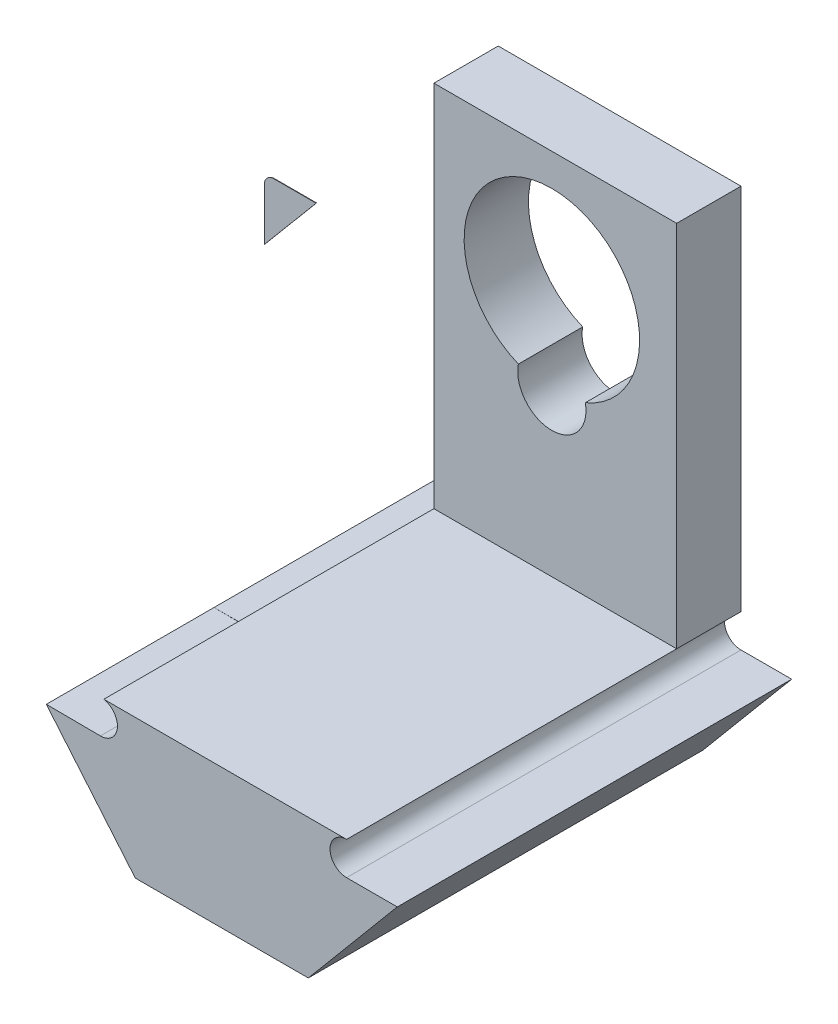
ISO-10303-21;
HEADER;
FILE_DESCRIPTION(('STEP AP214'),'2;1');
FILE_NAME('part.step','',(''),(''),'','','');
FILE_SCHEMA(('AUTOMOTIVE_DESIGN { 1 0 10303 214 1 1 1 1 }'));
ENDSEC;
DATA;
#1=APPLICATION_CONTEXT('core data for automotive mechanical design processes');
#2=APPLICATION_PROTOCOL_DEFINITION('international standard','automotive_design',2000,#1);
#3=PRODUCT_CONTEXT('',#1,'mechanical');
#4=PRODUCT('Part','Part','',(#3));
#5=PRODUCT_RELATED_PRODUCT_CATEGORY('part','',(#4));
#6=PRODUCT_DEFINITION_FORMATION('','',#4);
#7=PRODUCT_DEFINITION_CONTEXT('part definition',#1,'design');
#8=PRODUCT_DEFINITION('design','',#6,#7);
#9=PRODUCT_DEFINITION_SHAPE('','',#8);
#10=(LENGTH_UNIT() NAMED_UNIT(*) SI_UNIT(.MILLI.,.METRE.));
#11=(NAMED_UNIT(*) PLANE_ANGLE_UNIT() SI_UNIT($,.RADIAN.));
#12=(NAMED_UNIT(*) SI_UNIT($,.STERADIAN.) SOLID_ANGLE_UNIT());
#13=UNCERTAINTY_MEASURE_WITH_UNIT(LENGTH_MEASURE(1.E-05),#10,'distance_accuracy_value','');
#14=(GEOMETRIC_REPRESENTATION_CONTEXT(3) GLOBAL_UNCERTAINTY_ASSIGNED_CONTEXT((#13)) GLOBAL_UNIT_ASSIGNED_CONTEXT((#10,
#11,#12)) REPRESENTATION_CONTEXT('',''));
#15=CARTESIAN_POINT('',(0.,0.,0.));
#16=DIRECTION('',(0.,0.,1.));
#17=DIRECTION('',(1.,0.,0.));
#18=AXIS2_PLACEMENT_3D('',#15,#16,#17);
#19=CARTESIAN_POINT('',(11.8879802126074,48.7950976016774,23.2553245103919));
#20=DIRECTION('',(0.,0.,-1.));
#21=DIRECTION('',(-1.,0.,0.));
#22=AXIS2_PLACEMENT_3D('',#19,#20,#21);
#23=PLANE('',#22);
#24=DIRECTION('',(-0.99997936409339,0.00642428107882829,0.));
#25=VECTOR('',#24,1.);
#26=CARTESIAN_POINT('',(-7.63448275862069,-3.13103448275862,23.2553245103919));
#27=LINE('',#26,#25);
#28=CARTESIAN_POINT('',(-2.11682980058117,-3.16648216775161,23.2553245103919));
#29=VERTEX_POINT('',#28);
#30=CARTESIAN_POINT('',(-7.63448275862069,-3.13103448275862,23.2553245103919));
#31=VERTEX_POINT('',#30);
#32=EDGE_CURVE('E633',#29,#31,#27,.T.);
#33=ORIENTED_EDGE('',*,*,#32,.F.);
#34=CARTESIAN_POINT('',(-2.08448275862069,-1.43103448275862,23.2553245103919));
#35=DIRECTION('',(0.,0.,1.));
#36=DIRECTION('',(-0.201652920670486,-0.979457043256652,0.));
#37=AXIS2_PLACEMENT_3D('',#34,#35,#36);
#38=CIRCLE('',#37,1.73565549577098);
#39=CARTESIAN_POINT('',(-2.43448275862069,-3.13103448275862,23.2553245103919));
#40=VERTEX_POINT('',#39);
#41=EDGE_CURVE('E182',#40,#29,#38,.T.);
#42=ORIENTED_EDGE('',*,*,#41,.F.);
#43=DIRECTION('',(-1.,0.,0.));
#44=VECTOR('',#43,1.);
#45=CARTESIAN_POINT('',(0.,-3.13103448275862,23.2553245103919));
#46=LINE('',#45,#44);
#47=EDGE_CURVE('E195',#40,#31,#46,.T.);
#48=ORIENTED_EDGE('',*,*,#47,.T.);
#49=EDGE_LOOP('',(#33,#42,#48));
#50=FACE_BOUND('',#49,.T.);
#51=ADVANCED_FACE('F51',(#50),#23,.F.);
#52=CARTESIAN_POINT('',(43.5655172413793,0.268965517241385,-5.52600243472206));
#53=DIRECTION('',(0.,-1.,0.));
#54=DIRECTION('',(1.,0.,0.));
#55=AXIS2_PLACEMENT_3D('',#52,#53,#54);
#56=PLANE('',#55);
#57=DIRECTION('',(-1.,0.,0.));
#58=VECTOR('',#57,1.);
#59=CARTESIAN_POINT('',(23.1655172413793,0.268965517241382,6.6));
#60=LINE('',#59,#58);
#61=CARTESIAN_POINT('',(23.1655172413793,0.268965517241382,6.6));
#62=VERTEX_POINT('',#61);
#63=CARTESIAN_POINT('',(-1.73448275862069,0.268965517241379,6.6));
#64=VERTEX_POINT('',#63);
#65=EDGE_CURVE('E183',#62,#64,#60,.T.);
#66=ORIENTED_EDGE('',*,*,#65,.T.);
#67=DIRECTION('',(0.,0.,-1.));
#68=VECTOR('',#67,1.);
#69=CARTESIAN_POINT('',(-1.73448275862069,0.268965517241379,40.));
#70=LINE('',#69,#68);
#71=CARTESIAN_POINT('',(-1.73448275862069,0.268965517241379,23.2553245103919));
#72=VERTEX_POINT('',#71);
#73=EDGE_CURVE('E139',#72,#64,#70,.T.);
#74=ORIENTED_EDGE('',*,*,#73,.F.);
#75=DIRECTION('',(0.,0.,-1.));
#76=VECTOR('',#75,1.);
#77=CARTESIAN_POINT('',(-1.73448275862069,0.268965517241379,40.4553245103919));
#78=LINE('',#77,#76);
#79=CARTESIAN_POINT('',(-1.73448275862069,0.268965517241379,40.4553245103919));
#80=VERTEX_POINT('',#79);
#81=EDGE_CURVE('E77',#80,#72,#78,.T.);
#82=ORIENTED_EDGE('',*,*,#81,.F.);
#83=DIRECTION('',(-1.,0.,0.));
#84=VECTOR('',#83,1.);
#85=CARTESIAN_POINT('',(-1.73448275862069,0.268965517241379,40.4553245103919));
#86=LINE('',#85,#84);
#87=CARTESIAN_POINT('',(23.1655172413793,0.268965517241379,40.4553245103919));
#88=VERTEX_POINT('',#87);
#89=EDGE_CURVE('E309',#88,#80,#86,.T.);
#90=ORIENTED_EDGE('',*,*,#89,.F.);
#91=DIRECTION('',(0.,0.,-1.));
#92=VECTOR('',#91,1.);
#93=CARTESIAN_POINT('',(23.1655172413793,0.268965517241382,40.));
#94=LINE('',#93,#92);
#95=EDGE_CURVE('E196',#88,#62,#94,.T.);
#96=ORIENTED_EDGE('',*,*,#95,.T.);
#97=EDGE_LOOP('',(#66,#74,#82,#90,#96));
#98=FACE_BOUND('',#97,.T.);
#99=ADVANCED_FACE('F348',(#98),#56,.F.);
#100=CARTESIAN_POINT('',(23.1655172413793,-1.43103448275862,40.));
#101=DIRECTION('',(0.,0.,-1.));
#102=DIRECTION('',(-1.,0.,0.));
#103=AXIS2_PLACEMENT_3D('',#100,#101,#102);
#104=CYLINDRICAL_SURFACE('',#103,1.7);
#105=ORIENTED_EDGE('',*,*,#95,.F.);
#106=CARTESIAN_POINT('',(23.1655172413793,-1.43103448275862,40.4553245103919));
#107=DIRECTION('',(0.,0.,-1.));
#108=DIRECTION('',(-1.,0.,0.));
#109=AXIS2_PLACEMENT_3D('',#106,#107,#108);
#110=CIRCLE('',#109,1.7);
#111=CARTESIAN_POINT('',(23.1655172413793,-3.13103448275862,40.4553245103919));
#112=VERTEX_POINT('',#111);
#113=EDGE_CURVE('E306',#112,#88,#110,.T.);
#114=ORIENTED_EDGE('',*,*,#113,.F.);
#115=DIRECTION('',(0.,0.,-1.));
#116=VECTOR('',#115,1.);
#117=CARTESIAN_POINT('',(23.1655172413793,-3.13103448275862,40.));
#118=LINE('',#117,#116);
#119=CARTESIAN_POINT('',(23.1655172413793,-3.13103448275862,0.));
#120=VERTEX_POINT('',#119);
#121=EDGE_CURVE('E179',#112,#120,#118,.T.);
#122=ORIENTED_EDGE('',*,*,#121,.T.);
#123=CARTESIAN_POINT('',(23.1655172413793,-1.43103448275862,0.));
#124=DIRECTION('',(0.,0.,1.));
#125=DIRECTION('',(1.,0.,0.));
#126=AXIS2_PLACEMENT_3D('',#123,#124,#125);
#127=CIRCLE('',#126,1.7);
#128=CARTESIAN_POINT('',(23.1655172413793,0.268965517241382,-1.2E-05));
#129=VERTEX_POINT('',#128);
#130=EDGE_CURVE('E155',#129,#120,#127,.T.);
#131=ORIENTED_EDGE('',*,*,#130,.F.);
#132=DIRECTION('',(0.,0.,-1.));
#133=VECTOR('',#132,1.);
#134=CARTESIAN_POINT('',(23.1655172413793,0.268965517241382,6.6));
#135=LINE('',#134,#133);
#136=EDGE_CURVE('E209',#62,#129,#135,.T.);
#137=ORIENTED_EDGE('',*,*,#136,.F.);
#138=EDGE_LOOP('',(#105,#114,#122,#131,#137));
#139=FACE_BOUND('',#138,.T.);
#140=ADVANCED_FACE('F345',(#139),#104,.F.);
#141=CARTESIAN_POINT('',(-2.08448275862069,-1.43103448275862,40.));
#142=DIRECTION('',(0.,0.,-1.));
#143=DIRECTION('',(-1.,0.,0.));
#144=AXIS2_PLACEMENT_3D('',#141,#142,#143);
#145=CYLINDRICAL_SURFACE('',#144,1.73565549577098);
#146=DIRECTION('',(0.,0.,-1.));
#147=VECTOR('',#146,1.);
#148=CARTESIAN_POINT('',(-2.43448275862069,-3.13103448275862,40.));
#149=LINE('',#148,#147);
#150=CARTESIAN_POINT('',(-2.43448275862069,-3.13103448275862,0.));
#151=VERTEX_POINT('',#150);
#152=EDGE_CURVE('E144',#40,#151,#149,.T.);
#153=ORIENTED_EDGE('',*,*,#152,.F.);
#154=ORIENTED_EDGE('',*,*,#41,.T.);
#155=CARTESIAN_POINT('',(-2.07333948273424,-1.43216967997646,23.255324510392));
#156=DIRECTION('',(0.,0.,-1.));
#157=DIRECTION('',(0.195356452029121,0.980732306315334,0.));
#158=AXIS2_PLACEMENT_3D('',#155,#156,#157);
#159=CIRCLE('',#158,1.73455609269068);
#160=EDGE_CURVE('E321',#72,#29,#159,.T.);
#161=ORIENTED_EDGE('',*,*,#160,.F.);
#162=ORIENTED_EDGE('',*,*,#73,.T.);
#163=DIRECTION('',(0.,0.,-1.));
#164=VECTOR('',#163,1.);
#165=CARTESIAN_POINT('',(-1.73448275862069,0.268965517241379,40.));
#166=LINE('',#165,#164);
#167=CARTESIAN_POINT('',(-1.73448275862069,0.268965517241379,-6.00000000009447E-06));
#168=VERTEX_POINT('',#167);
#169=EDGE_CURVE('E135',#64,#168,#166,.T.);
#170=ORIENTED_EDGE('',*,*,#169,.T.);
#171=CARTESIAN_POINT('',(-2.08448275862069,-1.43103448275862,0.));
#172=DIRECTION('',(0.,0.,1.));
#173=DIRECTION('',(1.,0.,0.));
#174=AXIS2_PLACEMENT_3D('',#171,#172,#173);
#175=CIRCLE('',#174,1.73565549577098);
#176=EDGE_CURVE('E138',#168,#151,#175,.F.);
#177=ORIENTED_EDGE('',*,*,#176,.T.);
#178=EDGE_LOOP('',(#153,#154,#161,#162,#170,#177));
#179=FACE_BOUND('',#178,.T.);
#180=ADVANCED_FACE('F268',(#179),#145,.F.);
#181=CARTESIAN_POINT('',(0.,-3.13103448275862,40.));
#182=DIRECTION('',(0.,1.,0.));
#183=DIRECTION('',(0.,0.,1.));
#184=AXIS2_PLACEMENT_3D('',#181,#182,#183);
#185=PLANE('',#184);
#186=ORIENTED_EDGE('',*,*,#47,.F.);
#187=ORIENTED_EDGE('',*,*,#152,.T.);
#188=DIRECTION('',(1.,0.,0.));
#189=VECTOR('',#188,1.);
#190=CARTESIAN_POINT('',(0.,-3.13103448275862,0.));
#191=LINE('',#190,#189);
#192=CARTESIAN_POINT('',(-7.63448275862069,-3.13103448275862,0.));
#193=VERTEX_POINT('',#192);
#194=EDGE_CURVE('E188',#193,#151,#191,.T.);
#195=ORIENTED_EDGE('',*,*,#194,.F.);
#196=DIRECTION('',(0.,0.,-1.));
#197=VECTOR('',#196,1.);
#198=CARTESIAN_POINT('',(-7.63448275862069,-3.13103448275862,40.));
#199=LINE('',#198,#197);
#200=EDGE_CURVE('E165',#31,#193,#199,.T.);
#201=ORIENTED_EDGE('',*,*,#200,.F.);
#202=EDGE_LOOP('',(#186,#187,#195,#201));
#203=FACE_BOUND('',#202,.T.);
#204=ADVANCED_FACE('F264',(#203),#185,.T.);
#205=CARTESIAN_POINT('',(-6.02183190532703,-5.05291693077147,40.));
#206=DIRECTION('',(0.766044443118979,0.642787609686538,0.));
#207=DIRECTION('',(-0.642787609686538,0.766044443118979,0.));
#208=AXIS2_PLACEMENT_3D('',#205,#206,#207);
#209=PLANE('',#208);
#210=DIRECTION('',(0.,0.,-1.));
#211=VECTOR('',#210,1.);
#212=CARTESIAN_POINT('',(1.49310129892814,-14.0088655750481,40.));
#213=LINE('',#212,#211);
#214=CARTESIAN_POINT('',(1.49310129892814,-14.0088655750481,40.4553245103919));
#215=VERTEX_POINT('',#214);
#216=CARTESIAN_POINT('',(1.49310129892814,-14.0088655750481,0.));
#217=VERTEX_POINT('',#216);
#218=EDGE_CURVE('E169',#215,#217,#213,.T.);
#219=ORIENTED_EDGE('',*,*,#218,.F.);
#220=DIRECTION('',(0.642787609686538,-0.766044443118979,0.));
#221=VECTOR('',#220,1.);
#222=CARTESIAN_POINT('',(-7.63448275862069,-3.13103448275862,40.4553245103919));
#223=LINE('',#222,#221);
#224=CARTESIAN_POINT('',(-7.63448275862069,-3.13103448275862,40.4553245103919));
#225=VERTEX_POINT('',#224);
#226=EDGE_CURVE('E279',#225,#215,#223,.T.);
#227=ORIENTED_EDGE('',*,*,#226,.F.);
#228=DIRECTION('',(0.,0.,-1.));
#229=VECTOR('',#228,1.);
#230=CARTESIAN_POINT('',(-7.63448275862069,-3.13103448275862,40.4553245103919));
#231=LINE('',#230,#229);
#232=EDGE_CURVE('E315',#225,#31,#231,.T.);
#233=ORIENTED_EDGE('',*,*,#232,.T.);
#234=ORIENTED_EDGE('',*,*,#200,.T.);
#235=DIRECTION('',(0.642787609686538,-0.766044443118979,0.));
#236=VECTOR('',#235,1.);
#237=CARTESIAN_POINT('',(-6.02183190532703,-5.05291693077147,0.));
#238=LINE('',#237,#236);
#239=EDGE_CURVE('E168',#193,#217,#238,.T.);
#240=ORIENTED_EDGE('',*,*,#239,.T.);
#241=EDGE_LOOP('',(#219,#227,#233,#234,#240));
#242=FACE_BOUND('',#241,.T.);
#243=ADVANCED_FACE('F274',(#242),#209,.F.);
#244=CARTESIAN_POINT('',(0.,-14.0088655750481,40.));
#245=DIRECTION('',(0.,1.,0.));
#246=DIRECTION('',(-1.,0.,0.));
#247=AXIS2_PLACEMENT_3D('',#244,#245,#246);
#248=PLANE('',#247);
#249=DIRECTION('',(0.,0.,-1.));
#250=VECTOR('',#249,1.);
#251=CARTESIAN_POINT('',(19.2379331838305,-14.0088655750481,40.));
#252=LINE('',#251,#250);
#253=CARTESIAN_POINT('',(19.2379331838305,-14.0088655750481,40.4553245103919));
#254=VERTEX_POINT('',#253);
#255=CARTESIAN_POINT('',(19.2379331838305,-14.0088655750481,0.));
#256=VERTEX_POINT('',#255);
#257=EDGE_CURVE('E173',#254,#256,#252,.T.);
#258=ORIENTED_EDGE('',*,*,#257,.F.);
#259=DIRECTION('',(1.,0.,0.));
#260=VECTOR('',#259,1.);
#261=CARTESIAN_POINT('',(1.49310129892814,-14.0088655750481,40.4553245103919));
#262=LINE('',#261,#260);
#263=EDGE_CURVE('E289',#215,#254,#262,.T.);
#264=ORIENTED_EDGE('',*,*,#263,.F.);
#265=ORIENTED_EDGE('',*,*,#218,.T.);
#266=DIRECTION('',(1.,0.,0.));
#267=VECTOR('',#266,1.);
#268=CARTESIAN_POINT('',(0.,-14.0088655750481,0.));
#269=LINE('',#268,#267);
#270=EDGE_CURVE('E172',#217,#256,#269,.T.);
#271=ORIENTED_EDGE('',*,*,#270,.T.);
#272=EDGE_LOOP('',(#258,#264,#265,#271));
#273=FACE_BOUND('',#272,.T.);
#274=ADVANCED_FACE('F297',(#273),#248,.F.);
#275=CARTESIAN_POINT('',(18.187302326247,-15.2609586740635,40.));
#276=DIRECTION('',(0.766044443118979,-0.642787609686538,0.));
#277=DIRECTION('',(0.642787609686538,0.766044443118979,0.));
#278=AXIS2_PLACEMENT_3D('',#275,#276,#277);
#279=PLANE('',#278);
#280=DIRECTION('',(0.,0.,-1.));
#281=VECTOR('',#280,1.);
#282=CARTESIAN_POINT('',(28.3655172413793,-3.13103448275862,40.));
#283=LINE('',#282,#281);
#284=CARTESIAN_POINT('',(28.3655172413793,-3.13103448275862,40.4553245103919));
#285=VERTEX_POINT('',#284);
#286=CARTESIAN_POINT('',(28.3655172413793,-3.13103448275862,0.));
#287=VERTEX_POINT('',#286);
#288=EDGE_CURVE('E176',#285,#287,#283,.T.);
#289=ORIENTED_EDGE('',*,*,#288,.F.);
#290=DIRECTION('',(0.642787609686538,0.766044443118979,0.));
#291=VECTOR('',#290,1.);
#292=CARTESIAN_POINT('',(19.2379331838305,-14.0088655750481,40.4553245103919));
#293=LINE('',#292,#291);
#294=EDGE_CURVE('E298',#254,#285,#293,.T.);
#295=ORIENTED_EDGE('',*,*,#294,.F.);
#296=ORIENTED_EDGE('',*,*,#257,.T.);
#297=DIRECTION('',(-0.642787609686538,-0.766044443118979,0.));
#298=VECTOR('',#297,1.);
#299=CARTESIAN_POINT('',(18.187302326247,-15.2609586740635,0.));
#300=LINE('',#299,#298);
#301=EDGE_CURVE('E158',#287,#256,#300,.T.);
#302=ORIENTED_EDGE('',*,*,#301,.F.);
#303=EDGE_LOOP('',(#289,#295,#296,#302));
#304=FACE_BOUND('',#303,.T.);
#305=ADVANCED_FACE('F439',(#304),#279,.T.);
#306=CARTESIAN_POINT('',(0.,-3.13103448275863,40.));
#307=DIRECTION('',(0.,-1.,0.));
#308=DIRECTION('',(1.,0.,0.));
#309=AXIS2_PLACEMENT_3D('',#306,#307,#308);
#310=PLANE('',#309);
#311=ORIENTED_EDGE('',*,*,#121,.F.);
#312=DIRECTION('',(-1.,0.,0.));
#313=VECTOR('',#312,1.);
#314=CARTESIAN_POINT('',(28.3655172413793,-3.13103448275862,40.4553245103919));
#315=LINE('',#314,#313);
#316=EDGE_CURVE('E300',#285,#112,#315,.T.);
#317=ORIENTED_EDGE('',*,*,#316,.F.);
#318=ORIENTED_EDGE('',*,*,#288,.T.);
#319=DIRECTION('',(-1.,0.,0.));
#320=VECTOR('',#319,1.);
#321=CARTESIAN_POINT('',(0.,-3.13103448275863,0.));
#322=LINE('',#321,#320);
#323=EDGE_CURVE('E164',#287,#120,#322,.T.);
#324=ORIENTED_EDGE('',*,*,#323,.T.);
#325=EDGE_LOOP('',(#311,#317,#318,#324));
#326=FACE_BOUND('',#325,.T.);
#327=ADVANCED_FACE('F433',(#326),#310,.F.);
#328=CARTESIAN_POINT('',(0.,0.,0.));
#329=DIRECTION('',(0.,0.,1.));
#330=DIRECTION('',(1.,0.,0.));
#331=AXIS2_PLACEMENT_3D('',#328,#329,#330);
#332=PLANE('',#331);
#333=ORIENTED_EDGE('',*,*,#176,.F.);
#334=DIRECTION('',(1.,0.,0.));
#335=VECTOR('',#334,1.);
#336=CARTESIAN_POINT('',(0.,0.268965517241379,0.));
#337=LINE('',#336,#335);
#338=EDGE_CURVE('E159',#168,#129,#337,.T.);
#339=ORIENTED_EDGE('',*,*,#338,.T.);
#340=ORIENTED_EDGE('',*,*,#130,.T.);
#341=ORIENTED_EDGE('',*,*,#323,.F.);
#342=ORIENTED_EDGE('',*,*,#301,.T.);
#343=ORIENTED_EDGE('',*,*,#270,.F.);
#344=ORIENTED_EDGE('',*,*,#239,.F.);
#345=ORIENTED_EDGE('',*,*,#194,.T.);
#346=EDGE_LOOP('',(#333,#339,#340,#341,#342,#343,#344,#345));
#347=FACE_BOUND('',#346,.T.);
#348=ADVANCED_FACE('F271',(#347),#332,.F.);
#349=CARTESIAN_POINT('',(23.1655172413793,0.268965517241382,6.6));
#350=DIRECTION('',(0.,-1.,0.));
#351=DIRECTION('',(0.,0.,-1.));
#352=AXIS2_PLACEMENT_3D('',#349,#350,#351);
#353=PLANE('',#352);
#354=ORIENTED_EDGE('',*,*,#338,.F.);
#355=DIRECTION('',(-1.,0.,0.));
#356=VECTOR('',#355,1.);
#357=CARTESIAN_POINT('',(23.1655172413793,0.268965517241382,-1.2E-05));
#358=LINE('',#357,#356);
#359=EDGE_CURVE('E202',#129,#168,#358,.T.);
#360=ORIENTED_EDGE('',*,*,#359,.F.);
#361=EDGE_LOOP('',(#354,#360));
#362=FACE_BOUND('',#361,.T.);
#363=ADVANCED_FACE('F239',(#362),#353,.T.);
#364=CARTESIAN_POINT('',(23.1655172413793,0.268965517241382,6.6));
#365=DIRECTION('',(1.,0.,0.));
#366=DIRECTION('',(0.,0.,-1.));
#367=AXIS2_PLACEMENT_3D('',#364,#365,#366);
#368=PLANE('',#367);
#369=ORIENTED_EDGE('',*,*,#136,.T.);
#370=DIRECTION('',(0.,-1.,0.));
#371=VECTOR('',#370,1.);
#372=CARTESIAN_POINT('',(23.1655172413793,0.268965517241382,-1.2E-05));
#373=LINE('',#372,#371);
#374=CARTESIAN_POINT('',(23.1655172413793,38.0689655172414,-1.2E-05));
#375=VERTEX_POINT('',#374);
#376=EDGE_CURVE('E129',#375,#129,#373,.T.);
#377=ORIENTED_EDGE('',*,*,#376,.F.);
#378=DIRECTION('',(0.,0.,-1.));
#379=VECTOR('',#378,1.);
#380=CARTESIAN_POINT('',(23.1655172413793,38.0689655172414,6.6));
#381=LINE('',#380,#379);
#382=CARTESIAN_POINT('',(23.1655172413793,38.0689655172414,6.6));
#383=VERTEX_POINT('',#382);
#384=EDGE_CURVE('E212',#383,#375,#381,.T.);
#385=ORIENTED_EDGE('',*,*,#384,.F.);
#386=DIRECTION('',(0.,-1.,0.));
#387=VECTOR('',#386,1.);
#388=CARTESIAN_POINT('',(23.1655172413793,0.268965517241382,6.6));
#389=LINE('',#388,#387);
#390=EDGE_CURVE('E211',#383,#62,#389,.T.);
#391=ORIENTED_EDGE('',*,*,#390,.T.);
#392=EDGE_LOOP('',(#369,#377,#385,#391));
#393=FACE_BOUND('',#392,.T.);
#394=ADVANCED_FACE('F231',(#393),#368,.T.);
#395=CARTESIAN_POINT('',(23.1655172413793,38.0689655172414,6.6));
#396=DIRECTION('',(0.,1.,0.));
#397=DIRECTION('',(0.,0.,1.));
#398=AXIS2_PLACEMENT_3D('',#395,#396,#397);
#399=PLANE('',#398);
#400=DIRECTION('',(0.,0.,-1.));
#401=VECTOR('',#400,1.);
#402=CARTESIAN_POINT('',(-1.73448275862069,38.0689655172414,6.6));
#403=LINE('',#402,#401);
#404=CARTESIAN_POINT('',(-1.73448275862069,38.0689655172414,6.6));
#405=VERTEX_POINT('',#404);
#406=CARTESIAN_POINT('',(-1.73448275862069,38.0689655172414,-1.2E-05));
#407=VERTEX_POINT('',#406);
#408=EDGE_CURVE('E69',#405,#407,#403,.T.);
#409=ORIENTED_EDGE('',*,*,#408,.F.);
#410=DIRECTION('',(1.,0.,0.));
#411=VECTOR('',#410,1.);
#412=CARTESIAN_POINT('',(23.1655172413793,38.0689655172414,6.6));
#413=LINE('',#412,#411);
#414=EDGE_CURVE('E215',#405,#383,#413,.T.);
#415=ORIENTED_EDGE('',*,*,#414,.T.);
#416=ORIENTED_EDGE('',*,*,#384,.T.);
#417=DIRECTION('',(1.,0.,0.));
#418=VECTOR('',#417,1.);
#419=CARTESIAN_POINT('',(23.1655172413793,38.0689655172414,-1.2E-05));
#420=LINE('',#419,#418);
#421=EDGE_CURVE('E61',#407,#375,#420,.T.);
#422=ORIENTED_EDGE('',*,*,#421,.F.);
#423=EDGE_LOOP('',(#409,#415,#416,#422));
#424=FACE_BOUND('',#423,.T.);
#425=ADVANCED_FACE('F227',(#424),#399,.T.);
#426=CARTESIAN_POINT('',(0.,0.,6.6));
#427=DIRECTION('',(0.,0.,1.));
#428=DIRECTION('',(1.,0.,0.));
#429=AXIS2_PLACEMENT_3D('',#426,#427,#428);
#430=PLANE('',#429);
#431=DIRECTION('',(0.,1.,0.));
#432=VECTOR('',#431,1.);
#433=CARTESIAN_POINT('',(-1.73448275862069,39.7038720581021,6.6));
#434=LINE('',#433,#432);
#435=EDGE_CURVE('E317',#64,#405,#434,.T.);
#436=ORIENTED_EDGE('',*,*,#435,.F.);
#437=ORIENTED_EDGE('',*,*,#65,.F.);
#438=ORIENTED_EDGE('',*,*,#390,.F.);
#439=ORIENTED_EDGE('',*,*,#414,.F.);
#440=EDGE_LOOP('',(#436,#437,#438,#439));
#441=FACE_BOUND('',#440,.T.);
#442=CARTESIAN_POINT('',(10.3655172413793,25.7689655172414,6.6));
#443=DIRECTION('',(0.,0.,-1.));
#444=DIRECTION('',(-1.,0.,0.));
#445=AXIS2_PLACEMENT_3D('',#442,#443,#444);
#446=CIRCLE('',#445,9.);
#447=CARTESIAN_POINT('',(6.93231987801633,17.4495210727969,6.6));
#448=VERTEX_POINT('',#447);
#449=CARTESIAN_POINT('',(13.7987146047423,17.4495210727969,6.6));
#450=VERTEX_POINT('',#449);
#451=EDGE_CURVE('E119',#448,#450,#446,.T.);
#452=ORIENTED_EDGE('',*,*,#451,.T.);
#453=CARTESIAN_POINT('',(10.3655172413793,16.7689655172414,6.6));
#454=DIRECTION('',(0.,0.,-1.));
#455=DIRECTION('',(-1.,0.,0.));
#456=AXIS2_PLACEMENT_3D('',#453,#454,#455);
#457=CIRCLE('',#456,3.5);
#458=EDGE_CURVE('E123',#450,#448,#457,.T.);
#459=ORIENTED_EDGE('',*,*,#458,.T.);
#460=EDGE_LOOP('',(#452,#459));
#461=FACE_BOUND('',#460,.T.);
#462=ADVANCED_FACE('F386',(#441,#461),#430,.T.);
#463=CARTESIAN_POINT('',(10.3655172413793,25.7689655172414,6.6));
#464=DIRECTION('',(0.,0.,-1.));
#465=DIRECTION('',(-1.,0.,0.));
#466=AXIS2_PLACEMENT_3D('',#463,#464,#465);
#467=CYLINDRICAL_SURFACE('',#466,9.);
#468=DIRECTION('',(0.,0.,-1.));
#469=VECTOR('',#468,1.);
#470=CARTESIAN_POINT('',(6.93231987801633,17.4495210727969,6.6));
#471=LINE('',#470,#469);
#472=CARTESIAN_POINT('',(6.93231987801633,17.4495210727969,-1.2E-05));
#473=VERTEX_POINT('',#472);
#474=EDGE_CURVE('E112',#448,#473,#471,.T.);
#475=ORIENTED_EDGE('',*,*,#474,.T.);
#476=CARTESIAN_POINT('',(10.3655172413793,25.7689655172414,-1.2E-05));
#477=DIRECTION('',(0.,0.,-1.));
#478=DIRECTION('',(-1.,0.,0.));
#479=AXIS2_PLACEMENT_3D('',#476,#477,#478);
#480=CIRCLE('',#479,9.);
#481=CARTESIAN_POINT('',(13.7987146047423,17.4495210727969,-1.2E-05));
#482=VERTEX_POINT('',#481);
#483=EDGE_CURVE('E116',#473,#482,#480,.T.);
#484=ORIENTED_EDGE('',*,*,#483,.T.);
#485=DIRECTION('',(0.,0.,-1.));
#486=VECTOR('',#485,1.);
#487=CARTESIAN_POINT('',(13.7987146047423,17.4495210727969,6.6));
#488=LINE('',#487,#486);
#489=EDGE_CURVE('E127',#450,#482,#488,.T.);
#490=ORIENTED_EDGE('',*,*,#489,.F.);
#491=ORIENTED_EDGE('',*,*,#451,.F.);
#492=EDGE_LOOP('',(#475,#484,#490,#491));
#493=FACE_BOUND('',#492,.T.);
#494=ADVANCED_FACE('F114',(#493),#467,.F.);
#495=CARTESIAN_POINT('',(10.3655172413793,16.7689655172414,6.6));
#496=DIRECTION('',(0.,0.,-1.));
#497=DIRECTION('',(-1.,0.,0.));
#498=AXIS2_PLACEMENT_3D('',#495,#496,#497);
#499=CYLINDRICAL_SURFACE('',#498,3.5);
#500=ORIENTED_EDGE('',*,*,#489,.T.);
#501=CARTESIAN_POINT('',(10.3655172413793,16.7689655172414,-1.2E-05));
#502=DIRECTION('',(0.,0.,-1.));
#503=DIRECTION('',(-1.,0.,0.));
#504=AXIS2_PLACEMENT_3D('',#501,#502,#503);
#505=CIRCLE('',#504,3.5);
#506=EDGE_CURVE('E125',#482,#473,#505,.T.);
#507=ORIENTED_EDGE('',*,*,#506,.T.);
#508=ORIENTED_EDGE('',*,*,#474,.F.);
#509=ORIENTED_EDGE('',*,*,#458,.F.);
#510=EDGE_LOOP('',(#500,#507,#508,#509));
#511=FACE_BOUND('',#510,.T.);
#512=ADVANCED_FACE('F126',(#511),#499,.F.);
#513=CARTESIAN_POINT('',(0.,0.,-1.2E-05));
#514=DIRECTION('',(0.,0.,1.));
#515=DIRECTION('',(1.,0.,0.));
#516=AXIS2_PLACEMENT_3D('',#513,#514,#515);
#517=PLANE('',#516);
#518=ORIENTED_EDGE('',*,*,#359,.T.);
#519=DIRECTION('',(0.,1.,0.));
#520=VECTOR('',#519,1.);
#521=CARTESIAN_POINT('',(-1.73448275862069,0.,-1.2E-05));
#522=LINE('',#521,#520);
#523=EDGE_CURVE('E12',#168,#407,#522,.T.);
#524=ORIENTED_EDGE('',*,*,#523,.T.);
#525=ORIENTED_EDGE('',*,*,#421,.T.);
#526=ORIENTED_EDGE('',*,*,#376,.T.);
#527=EDGE_LOOP('',(#518,#524,#525,#526));
#528=FACE_BOUND('',#527,.T.);
#529=ORIENTED_EDGE('',*,*,#483,.F.);
#530=ORIENTED_EDGE('',*,*,#506,.F.);
#531=EDGE_LOOP('',(#529,#530));
#532=FACE_BOUND('',#531,.T.);
#533=ADVANCED_FACE('F53',(#528,#532),#517,.F.);
#534=CARTESIAN_POINT('',(-1.73448275862069,39.7038720581021,-3.4));
#535=DIRECTION('',(1.,0.,0.));
#536=DIRECTION('',(0.,0.,-1.));
#537=AXIS2_PLACEMENT_3D('',#534,#535,#536);
#538=PLANE('',#537);
#539=ORIENTED_EDGE('',*,*,#408,.T.);
#540=ORIENTED_EDGE('',*,*,#523,.F.);
#541=ORIENTED_EDGE('',*,*,#169,.F.);
#542=ORIENTED_EDGE('',*,*,#435,.T.);
#543=EDGE_LOOP('',(#539,#540,#541,#542));
#544=FACE_BOUND('',#543,.T.);
#545=ADVANCED_FACE('F341',(#544),#538,.F.);
#546=CARTESIAN_POINT('',(-7.63448275862069,-3.13103448275862,40.4553245103919));
#547=DIRECTION('',(-0.00642428107882829,-0.99997936409339,0.));
#548=DIRECTION('',(0.99997936409339,-0.00642428107882829,0.));
#549=AXIS2_PLACEMENT_3D('',#546,#547,#548);
#550=PLANE('',#549);
#551=ORIENTED_EDGE('',*,*,#32,.T.);
#552=ORIENTED_EDGE('',*,*,#232,.F.);
#553=DIRECTION('',(-0.99997936409339,0.00642428107882829,0.));
#554=VECTOR('',#553,1.);
#555=CARTESIAN_POINT('',(-7.63448275862069,-3.13103448275862,40.4553245103919));
#556=LINE('',#555,#554);
#557=CARTESIAN_POINT('',(-2.08448275862068,-3.1666899785296,40.4553245103919));
#558=VERTEX_POINT('',#557);
#559=EDGE_CURVE('E293',#558,#225,#556,.T.);
#560=ORIENTED_EDGE('',*,*,#559,.F.);
#561=DIRECTION('',(0.,0.,-1.));
#562=VECTOR('',#561,1.);
#563=CARTESIAN_POINT('',(-2.08448275862068,-3.1666899785296,40.4553245103919));
#564=LINE('',#563,#562);
#565=EDGE_CURVE('E314',#558,#29,#564,.T.);
#566=ORIENTED_EDGE('',*,*,#565,.T.);
#567=EDGE_LOOP('',(#551,#552,#560,#566));
#568=FACE_BOUND('',#567,.T.);
#569=ADVANCED_FACE('F338',(#568),#550,.F.);
#570=CARTESIAN_POINT('',(-2.07333948273424,-1.43216967997646,40.4553245103919));
#571=DIRECTION('',(0.,0.,-1.));
#572=DIRECTION('',(-1.,0.,0.));
#573=AXIS2_PLACEMENT_3D('',#570,#571,#572);
#574=CYLINDRICAL_SURFACE('',#573,1.73455609269068);
#575=ORIENTED_EDGE('',*,*,#160,.T.);
#576=ORIENTED_EDGE('',*,*,#565,.F.);
#577=CARTESIAN_POINT('',(-2.07333948273424,-1.43216967997646,40.4553245103919));
#578=DIRECTION('',(0.,0.,-1.));
#579=DIRECTION('',(1.,0.,0.));
#580=AXIS2_PLACEMENT_3D('',#577,#578,#579);
#581=CIRCLE('',#580,1.73455609269068);
#582=EDGE_CURVE('E312',#80,#558,#581,.T.);
#583=ORIENTED_EDGE('',*,*,#582,.F.);
#584=ORIENTED_EDGE('',*,*,#81,.T.);
#585=EDGE_LOOP('',(#575,#576,#583,#584));
#586=FACE_BOUND('',#585,.T.);
#587=ADVANCED_FACE('F328',(#586),#574,.F.);
#588=CARTESIAN_POINT('',(-2.07333948273424,-1.43216967997646,40.4553245103919));
#589=DIRECTION('',(0.,0.,1.));
#590=DIRECTION('',(1.,0.,0.));
#591=AXIS2_PLACEMENT_3D('',#588,#589,#590);
#592=PLANE('',#591);
#593=ORIENTED_EDGE('',*,*,#559,.T.);
#594=ORIENTED_EDGE('',*,*,#226,.T.);
#595=ORIENTED_EDGE('',*,*,#263,.T.);
#596=ORIENTED_EDGE('',*,*,#294,.T.);
#597=ORIENTED_EDGE('',*,*,#316,.T.);
#598=ORIENTED_EDGE('',*,*,#113,.T.);
#599=ORIENTED_EDGE('',*,*,#89,.T.);
#600=ORIENTED_EDGE('',*,*,#582,.T.);
#601=EDGE_LOOP('',(#593,#594,#595,#596,#597,#598,#599,#600));
#602=FACE_BOUND('',#601,.T.);
#603=ADVANCED_FACE('F287',(#602),#592,.T.);
#604=CLOSED_SHELL('',(#51,#99,#140,#180,#204,#243,#274,#305,#327,#348,#363,#394,#425,#462,#494,
#512,#533,#545,#569,#587,#603));
#605=MANIFOLD_SOLID_BREP('B2',#604);
#606=CARTESIAN_POINT('',(43.5655172413793,0.268965517241383,23.3));
#607=DIRECTION('',(0.,0.,-1.));
#608=DIRECTION('',(-1.,0.,0.));
#609=AXIS2_PLACEMENT_3D('',#606,#607,#608);
#610=PLANE('',#609);
#611=DIRECTION('',(-1.,0.,0.));
#612=VECTOR('',#611,1.);
#613=CARTESIAN_POINT('',(0.,38.0689655172414,23.3));
#614=LINE('',#613,#612);
#615=CARTESIAN_POINT('',(2.88768673659839,38.0689655172414,23.3));
#616=VERTEX_POINT('',#615);
#617=CARTESIAN_POINT('',(-1.4344827586207,38.0689655172414,23.3));
#618=VERTEX_POINT('',#617);
#619=EDGE_CURVE('E710',#616,#618,#614,.T.);
#620=ORIENTED_EDGE('',*,*,#619,.T.);
#621=CARTESIAN_POINT('',(-1.4344827586207,37.0689655172414,23.3));
#622=DIRECTION('',(0.,0.,-1.));
#623=DIRECTION('',(-1.,0.,0.));
#624=AXIS2_PLACEMENT_3D('',#621,#622,#623);
#625=CIRCLE('',#624,1.);
#626=CARTESIAN_POINT('',(-2.4344827586207,37.0689655172414,23.3));
#627=VERTEX_POINT('',#626);
#628=EDGE_CURVE('E49',#618,#627,#625,.F.);
#629=ORIENTED_EDGE('',*,*,#628,.T.);
#630=DIRECTION('',(0.,-1.,0.));
#631=VECTOR('',#630,1.);
#632=CARTESIAN_POINT('',(-2.43448275862069,0.268965517241377,23.3));
#633=LINE('',#632,#631);
#634=CARTESIAN_POINT('',(-2.4344827586207,31.7262509009187,23.3));
#635=VERTEX_POINT('',#634);
#636=EDGE_CURVE('E705',#627,#635,#633,.T.);
#637=ORIENTED_EDGE('',*,*,#636,.T.);
#638=DIRECTION('',(-0.642787609686538,-0.766044443118979,0.));
#639=VECTOR('',#638,1.);
#640=CARTESIAN_POINT('',(1.08191988775833,35.9169363877487,23.3));
#641=LINE('',#640,#639);
#642=EDGE_CURVE('E702',#616,#635,#641,.T.);
#643=ORIENTED_EDGE('',*,*,#642,.F.);
#644=EDGE_LOOP('',(#620,#629,#637,#643));
#645=FACE_BOUND('',#644,.T.);
#646=ADVANCED_FACE('F643',(#645),#610,.F.);
#647=CARTESIAN_POINT('',(-17.050742057226,14.3072713715172,0.));
#648=DIRECTION('',(0.766044443118979,-0.642787609686538,0.));
#649=DIRECTION('',(0.642787609686538,0.766044443118979,0.));
#650=AXIS2_PLACEMENT_3D('',#647,#648,#649);
#651=PLANE('',#650);
#652=ORIENTED_EDGE('',*,*,#642,.T.);
#653=DIRECTION('',(0.,0.,-1.));
#654=VECTOR('',#653,1.);
#655=CARTESIAN_POINT('',(-2.4344827586207,31.7262509009187,40.));
#656=LINE('',#655,#654);
#657=CARTESIAN_POINT('',(-2.4344827586207,31.7262509009187,23.2553245103919));
#658=VERTEX_POINT('',#657);
#659=EDGE_CURVE('E688',#635,#658,#656,.T.);
#660=ORIENTED_EDGE('',*,*,#659,.T.);
#661=DIRECTION('',(0.642787609686538,0.766044443118979,0.));
#662=VECTOR('',#661,1.);
#663=CARTESIAN_POINT('',(11.8879802126074,48.7950976016774,23.2553245103919));
#664=LINE('',#663,#662);
#665=CARTESIAN_POINT('',(2.88768673659839,38.0689655172414,23.2553245103919));
#666=VERTEX_POINT('',#665);
#667=EDGE_CURVE('E682',#658,#666,#664,.T.);
#668=ORIENTED_EDGE('',*,*,#667,.T.);
#669=DIRECTION('',(0.,0.,-1.));
#670=VECTOR('',#669,1.);
#671=CARTESIAN_POINT('',(2.88768673659839,38.0689655172414,40.));
#672=LINE('',#671,#670);
#673=EDGE_CURVE('E703',#616,#666,#672,.T.);
#674=ORIENTED_EDGE('',*,*,#673,.F.);
#675=EDGE_LOOP('',(#652,#660,#668,#674));
#676=FACE_BOUND('',#675,.T.);
#677=ADVANCED_FACE('F700',(#676),#651,.T.);
#678=CARTESIAN_POINT('',(-1.4344827586207,37.0689655172414,40.));
#679=DIRECTION('',(0.,0.,1.));
#680=DIRECTION('',(1.,0.,0.));
#681=AXIS2_PLACEMENT_3D('',#678,#679,#680);
#682=CYLINDRICAL_SURFACE('',#681,1.);
#683=CARTESIAN_POINT('',(-1.4344827586207,37.0689655172414,23.2553245103919));
#684=DIRECTION('',(0.,0.,1.));
#685=DIRECTION('',(1.,0.,0.));
#686=AXIS2_PLACEMENT_3D('',#683,#684,#685);
#687=CIRCLE('',#686,1.);
#688=CARTESIAN_POINT('',(-2.4344827586207,37.0689655172414,23.2553245103919));
#689=VERTEX_POINT('',#688);
#690=CARTESIAN_POINT('',(-1.4344827586207,38.0689655172414,23.2553245103919));
#691=VERTEX_POINT('',#690);
#692=EDGE_CURVE('E689',#689,#691,#687,.F.);
#693=ORIENTED_EDGE('',*,*,#692,.F.);
#694=DIRECTION('',(0.,0.,-1.));
#695=VECTOR('',#694,1.);
#696=CARTESIAN_POINT('',(-2.4344827586207,37.0689655172414,16.7));
#697=LINE('',#696,#695);
#698=EDGE_CURVE('E697',#627,#689,#697,.T.);
#699=ORIENTED_EDGE('',*,*,#698,.F.);
#700=ORIENTED_EDGE('',*,*,#628,.F.);
#701=DIRECTION('',(0.,0.,-1.));
#702=VECTOR('',#701,1.);
#703=CARTESIAN_POINT('',(-1.4344827586207,38.0689655172414,23.3));
#704=LINE('',#703,#702);
#705=EDGE_CURVE('E651',#691,#618,#704,.F.);
#706=ORIENTED_EDGE('',*,*,#705,.F.);
#707=EDGE_LOOP('',(#693,#699,#700,#706));
#708=FACE_BOUND('',#707,.T.);
#709=ADVANCED_FACE('F645',(#708),#682,.T.);
#710=CARTESIAN_POINT('',(-2.43448275862069,0.,40.));
#711=DIRECTION('',(1.,0.,0.));
#712=DIRECTION('',(0.,1.,0.));
#713=AXIS2_PLACEMENT_3D('',#710,#711,#712);
#714=PLANE('',#713);
#715=ORIENTED_EDGE('',*,*,#698,.T.);
#716=DIRECTION('',(0.,-1.,0.));
#717=VECTOR('',#716,1.);
#718=CARTESIAN_POINT('',(-2.4344827586207,38.0689655172414,23.2553245103919));
#719=LINE('',#718,#717);
#720=EDGE_CURVE('E658',#689,#658,#719,.T.);
#721=ORIENTED_EDGE('',*,*,#720,.T.);
#722=ORIENTED_EDGE('',*,*,#659,.F.);
#723=ORIENTED_EDGE('',*,*,#636,.F.);
#724=EDGE_LOOP('',(#715,#721,#722,#723));
#725=FACE_BOUND('',#724,.T.);
#726=ADVANCED_FACE('F694',(#725),#714,.F.);
#727=CARTESIAN_POINT('',(0.,38.0689655172414,40.));
#728=DIRECTION('',(0.,1.,0.));
#729=DIRECTION('',(0.,0.,1.));
#730=AXIS2_PLACEMENT_3D('',#727,#728,#729);
#731=PLANE('',#730);
#732=DIRECTION('',(-1.,0.,0.));
#733=VECTOR('',#732,1.);
#734=CARTESIAN_POINT('',(-2.4344827586207,38.0689655172414,23.2553245103919));
#735=LINE('',#734,#733);
#736=EDGE_CURVE('E684',#666,#691,#735,.T.);
#737=ORIENTED_EDGE('',*,*,#736,.T.);
#738=ORIENTED_EDGE('',*,*,#705,.T.);
#739=ORIENTED_EDGE('',*,*,#619,.F.);
#740=ORIENTED_EDGE('',*,*,#673,.T.);
#741=EDGE_LOOP('',(#737,#738,#739,#740));
#742=FACE_BOUND('',#741,.T.);
#743=ADVANCED_FACE('F717',(#742),#731,.T.);
#744=CARTESIAN_POINT('',(0.,0.,23.2553245103919));
#745=DIRECTION('',(0.,0.,1.));
#746=DIRECTION('',(1.,0.,0.));
#747=AXIS2_PLACEMENT_3D('',#744,#745,#746);
#748=PLANE('',#747);
#749=ORIENTED_EDGE('',*,*,#667,.F.);
#750=ORIENTED_EDGE('',*,*,#720,.F.);
#751=ORIENTED_EDGE('',*,*,#692,.T.);
#752=ORIENTED_EDGE('',*,*,#736,.F.);
#753=EDGE_LOOP('',(#749,#750,#751,#752));
#754=FACE_BOUND('',#753,.T.);
#755=ADVANCED_FACE('F683',(#754),#748,.F.);
#756=CLOSED_SHELL('',(#646,#677,#709,#726,#743,#755));
#757=MANIFOLD_SOLID_BREP('B6_NOT_SHOWN',#756);
#758=ADVANCED_BREP_SHAPE_REPRESENTATION('',(#18,#605,#757),#14);
#759=SHAPE_DEFINITION_REPRESENTATION(#9,#758);
ENDSEC;
END-ISO-10303-21;
